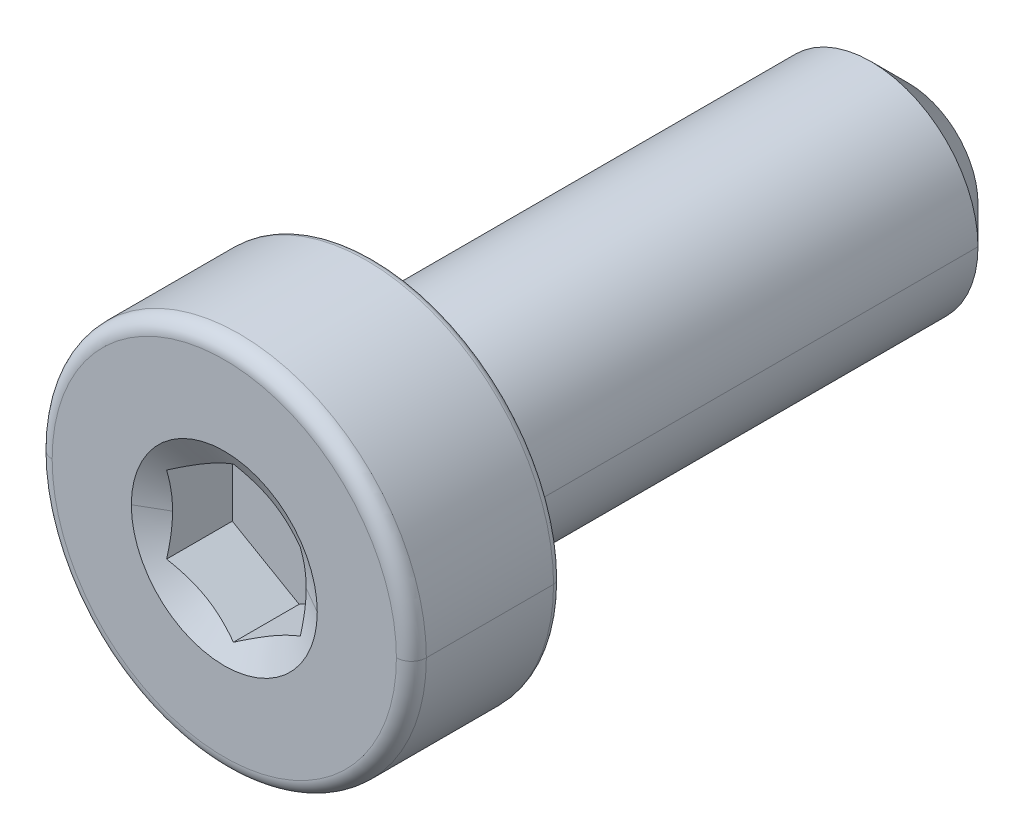
ISO-10303-21;
HEADER;
FILE_DESCRIPTION(('STEP AP214'),'2;1');
FILE_NAME('part.step','',(''),(''),'','','');
FILE_SCHEMA(('AUTOMOTIVE_DESIGN { 1 0 10303 214 1 1 1 1 }'));
ENDSEC;
DATA;
#1=APPLICATION_CONTEXT('core data for automotive mechanical design processes');
#2=APPLICATION_PROTOCOL_DEFINITION('international standard','automotive_design',2000,#1);
#3=PRODUCT_CONTEXT('',#1,'mechanical');
#4=PRODUCT('Part','Part','',(#3));
#5=PRODUCT_RELATED_PRODUCT_CATEGORY('part','',(#4));
#6=PRODUCT_DEFINITION_FORMATION('','',#4);
#7=PRODUCT_DEFINITION_CONTEXT('part definition',#1,'design');
#8=PRODUCT_DEFINITION('design','',#6,#7);
#9=PRODUCT_DEFINITION_SHAPE('','',#8);
#10=(LENGTH_UNIT() NAMED_UNIT(*) SI_UNIT(.MILLI.,.METRE.));
#11=(NAMED_UNIT(*) PLANE_ANGLE_UNIT() SI_UNIT($,.RADIAN.));
#12=(NAMED_UNIT(*) SI_UNIT($,.STERADIAN.) SOLID_ANGLE_UNIT());
#13=UNCERTAINTY_MEASURE_WITH_UNIT(LENGTH_MEASURE(1.E-05),#10,'distance_accuracy_value','');
#14=(GEOMETRIC_REPRESENTATION_CONTEXT(3) GLOBAL_UNCERTAINTY_ASSIGNED_CONTEXT((#13)) GLOBAL_UNIT_ASSIGNED_CONTEXT((#10,
#11,#12)) REPRESENTATION_CONTEXT('',''));
#15=CARTESIAN_POINT('',(0.,0.,0.));
#16=DIRECTION('',(0.,0.,1.));
#17=DIRECTION('',(1.,0.,0.));
#18=AXIS2_PLACEMENT_3D('',#15,#16,#17);
#19=CARTESIAN_POINT('',(0.,1.44337567297406,5.));
#20=DIRECTION('',(-0.5,0.866025403784439,0.));
#21=DIRECTION('',(0.,0.,1.));
#22=AXIS2_PLACEMENT_3D('',#19,#20,#21);
#23=PLANE('',#22);
#24=DIRECTION('',(0.,0.,1.));
#25=VECTOR('',#24,1.);
#26=CARTESIAN_POINT('',(0.,1.44337567297406,5.));
#27=LINE('',#26,#25);
#28=CARTESIAN_POINT('',(0.,1.44337567297406,5.));
#29=VERTEX_POINT('',#28);
#30=CARTESIAN_POINT('',(0.,1.44337567297406,6.22904424442379));
#31=VERTEX_POINT('',#30);
#32=EDGE_CURVE('E10',#29,#31,#27,.T.);
#33=ORIENTED_EDGE('',*,*,#32,.T.);
#34=CARTESIAN_POINT('',(0.,1.44337567297406,6.22904424442379));
#35=CARTESIAN_POINT('',(-0.334032893502101,1.25052169199244,6.11769994658497));
#36=CARTESIAN_POINT('',(-0.623808446138344,1.08321969867333,6.11739918476256));
#37=CARTESIAN_POINT('',(-0.914160739735603,0.915584723805126,6.1170978243332));
#38=CARTESIAN_POINT('',(-1.25,0.721687836487032,6.22904424442379));
#39=B_SPLINE_CURVE_WITH_KNOTS('',2,(#34,#35,#36,#37,#38),.UNSPECIFIED.,.F.,.F.,(3,2,3),(0.,0.5,
1.),.UNSPECIFIED.);
#40=CARTESIAN_POINT('',(-1.25,0.721687836487032,6.22904424442379));
#41=VERTEX_POINT('',#40);
#42=EDGE_CURVE('E180',#31,#41,#39,.T.);
#43=ORIENTED_EDGE('',*,*,#42,.T.);
#44=DIRECTION('',(0.,0.,1.));
#45=VECTOR('',#44,1.);
#46=CARTESIAN_POINT('',(-1.25,0.721687836487032,5.));
#47=LINE('',#46,#45);
#48=CARTESIAN_POINT('',(-1.25,0.721687836487032,5.));
#49=VERTEX_POINT('',#48);
#50=EDGE_CURVE('E174',#49,#41,#47,.T.);
#51=ORIENTED_EDGE('',*,*,#50,.F.);
#52=DIRECTION('',(-0.866025403784439,-0.5,0.));
#53=VECTOR('',#52,1.);
#54=CARTESIAN_POINT('',(0.,1.44337567297406,5.));
#55=LINE('',#54,#53);
#56=EDGE_CURVE('E409',#29,#49,#55,.T.);
#57=ORIENTED_EDGE('',*,*,#56,.F.);
#58=EDGE_LOOP('',(#33,#43,#51,#57));
#59=FACE_BOUND('',#58,.T.);
#60=ADVANCED_FACE('F16',(#59),#23,.F.);
#61=CARTESIAN_POINT('',(1.25,0.72168783648703,5.));
#62=DIRECTION('',(0.5,0.866025403784439,0.));
#63=DIRECTION('',(0.,0.,-1.));
#64=AXIS2_PLACEMENT_3D('',#61,#62,#63);
#65=PLANE('',#64);
#66=DIRECTION('',(0.,0.,1.));
#67=VECTOR('',#66,1.);
#68=CARTESIAN_POINT('',(1.25,0.72168783648703,5.));
#69=LINE('',#68,#67);
#70=CARTESIAN_POINT('',(1.25,0.72168783648703,5.));
#71=VERTEX_POINT('',#70);
#72=CARTESIAN_POINT('',(1.25,0.72168783648703,6.22904424442379));
#73=VERTEX_POINT('',#72);
#74=EDGE_CURVE('E28',#71,#73,#69,.T.);
#75=ORIENTED_EDGE('',*,*,#74,.T.);
#76=CARTESIAN_POINT('',(1.25,0.72168783648703,6.22904424442379));
#77=CARTESIAN_POINT('',(0.91596710649632,0.914541817469569,6.11769994658444));
#78=CARTESIAN_POINT('',(0.626191553861657,1.08184381078776,6.11739918476256));
#79=CARTESIAN_POINT('',(0.33583926026281,1.24947878565688,6.11709782433372));
#80=CARTESIAN_POINT('',(0.,1.44337567297406,6.22904424442379));
#81=B_SPLINE_CURVE_WITH_KNOTS('',2,(#76,#77,#78,#79,#80),.UNSPECIFIED.,.F.,.F.,(3,2,3),(0.,0.5,
1.),.UNSPECIFIED.);
#82=EDGE_CURVE('E338',#73,#31,#81,.T.);
#83=ORIENTED_EDGE('',*,*,#82,.T.);
#84=ORIENTED_EDGE('',*,*,#32,.F.);
#85=DIRECTION('',(-0.866025403784439,0.5,0.));
#86=VECTOR('',#85,1.);
#87=CARTESIAN_POINT('',(1.25,0.72168783648703,5.));
#88=LINE('',#87,#86);
#89=EDGE_CURVE('E378',#71,#29,#88,.T.);
#90=ORIENTED_EDGE('',*,*,#89,.F.);
#91=EDGE_LOOP('',(#75,#83,#84,#90));
#92=FACE_BOUND('',#91,.T.);
#93=ADVANCED_FACE('F300',(#92),#65,.F.);
#94=CARTESIAN_POINT('',(1.25,-0.721687836487031,5.));
#95=DIRECTION('',(1.,0.,0.));
#96=DIRECTION('',(0.,1.,0.));
#97=AXIS2_PLACEMENT_3D('',#94,#95,#96);
#98=PLANE('',#97);
#99=DIRECTION('',(0.,0.,1.));
#100=VECTOR('',#99,1.);
#101=CARTESIAN_POINT('',(1.25,-0.721687836487031,5.));
#102=LINE('',#101,#100);
#103=CARTESIAN_POINT('',(1.25,-0.721687836487031,5.));
#104=VERTEX_POINT('',#103);
#105=CARTESIAN_POINT('',(1.25,-0.721687836487031,6.22904424442379));
#106=VERTEX_POINT('',#105);
#107=EDGE_CURVE('E52',#104,#106,#102,.T.);
#108=ORIENTED_EDGE('',*,*,#107,.T.);
#109=CARTESIAN_POINT('',(1.25,-0.721687836487031,6.22904424442379));
#110=CARTESIAN_POINT('',(1.25,-0.334936490529257,6.1173987475747));
#111=CARTESIAN_POINT('',(1.25,2.57064335096313E-13,6.1173987475747));
#112=B_SPLINE_CURVE_WITH_KNOTS('',2,(#109,#110,#111),.UNSPECIFIED.,.F.,.F.,(3,3),(0.,1.),.UNSPECIFIED.);
#113=CARTESIAN_POINT('',(1.25,2.56757606599011E-13,6.1173987475747));
#114=VERTEX_POINT('',#113);
#115=EDGE_CURVE('E285',#106,#114,#112,.T.);
#116=ORIENTED_EDGE('',*,*,#115,.T.);
#117=CARTESIAN_POINT('',(1.25,2.57064335096313E-13,6.1173987475747));
#118=CARTESIAN_POINT('',(1.25,0.178322210871916,6.1173987475747));
#119=CARTESIAN_POINT('',(1.25,0.366220993478989,6.14773436286669));
#120=CARTESIAN_POINT('',(1.25,0.533672056437617,6.17476876381208));
#121=CARTESIAN_POINT('',(1.25,0.721687836487029,6.22904424442379));
#122=B_SPLINE_CURVE_WITH_KNOTS('',2,(#117,#118,#119,#120,#121),.UNSPECIFIED.,.F.,.F.,(3,2,3),
(0.,0.5,1.),.UNSPECIFIED.);
#123=EDGE_CURVE('E317',#114,#73,#122,.T.);
#124=ORIENTED_EDGE('',*,*,#123,.T.);
#125=ORIENTED_EDGE('',*,*,#74,.F.);
#126=DIRECTION('',(0.,1.,0.));
#127=VECTOR('',#126,1.);
#128=CARTESIAN_POINT('',(1.25,-0.721687836487031,5.));
#129=LINE('',#128,#127);
#130=EDGE_CURVE('E387',#104,#71,#129,.T.);
#131=ORIENTED_EDGE('',*,*,#130,.F.);
#132=EDGE_LOOP('',(#108,#116,#124,#125,#131));
#133=FACE_BOUND('',#132,.T.);
#134=ADVANCED_FACE('F291',(#133),#98,.F.);
#135=CARTESIAN_POINT('',(0.,-1.44337567297406,5.));
#136=DIRECTION('',(0.5,-0.866025403784438,0.));
#137=DIRECTION('',(0.,0.,-1.));
#138=AXIS2_PLACEMENT_3D('',#135,#136,#137);
#139=PLANE('',#138);
#140=DIRECTION('',(0.,0.,1.));
#141=VECTOR('',#140,1.);
#142=CARTESIAN_POINT('',(0.,-1.44337567297406,5.));
#143=LINE('',#142,#141);
#144=CARTESIAN_POINT('',(0.,-1.44337567297406,5.));
#145=VERTEX_POINT('',#144);
#146=CARTESIAN_POINT('',(0.,-1.44337567297406,6.22904424442379));
#147=VERTEX_POINT('',#146);
#148=EDGE_CURVE('E385',#145,#147,#143,.T.);
#149=ORIENTED_EDGE('',*,*,#148,.T.);
#150=CARTESIAN_POINT('',(0.,-1.44337567297406,6.22904424442379));
#151=CARTESIAN_POINT('',(0.334032893503682,-1.25052169199152,6.11769994658444));
#152=CARTESIAN_POINT('',(0.623808446138341,-1.08321969867333,6.11739918476256));
#153=CARTESIAN_POINT('',(0.914160739737189,-0.915584723804207,6.11709782433372));
#154=CARTESIAN_POINT('',(1.25,-0.721687836487031,6.22904424442379));
#155=B_SPLINE_CURVE_WITH_KNOTS('',2,(#150,#151,#152,#153,#154),.UNSPECIFIED.,.F.,.F.,(3,2,3),
(0.,0.5,1.),.UNSPECIFIED.);
#156=EDGE_CURVE('E544',#147,#106,#155,.T.);
#157=ORIENTED_EDGE('',*,*,#156,.T.);
#158=ORIENTED_EDGE('',*,*,#107,.F.);
#159=DIRECTION('',(0.866025403784438,0.5,0.));
#160=VECTOR('',#159,1.);
#161=CARTESIAN_POINT('',(0.,-1.44337567297406,5.));
#162=LINE('',#161,#160);
#163=EDGE_CURVE('E395',#145,#104,#162,.T.);
#164=ORIENTED_EDGE('',*,*,#163,.F.);
#165=EDGE_LOOP('',(#149,#157,#158,#164));
#166=FACE_BOUND('',#165,.T.);
#167=ADVANCED_FACE('F299',(#166),#139,.F.);
#168=CARTESIAN_POINT('',(-1.25,-0.721687836487033,5.));
#169=DIRECTION('',(-0.5,-0.866025403784439,0.));
#170=DIRECTION('',(-0.866025403784439,0.5,0.));
#171=AXIS2_PLACEMENT_3D('',#168,#169,#170);
#172=PLANE('',#171);
#173=DIRECTION('',(0.,0.,1.));
#174=VECTOR('',#173,1.);
#175=CARTESIAN_POINT('',(-1.25,-0.721687836487033,5.));
#176=LINE('',#175,#174);
#177=CARTESIAN_POINT('',(-1.25,-0.721687836487033,5.));
#178=VERTEX_POINT('',#177);
#179=CARTESIAN_POINT('',(-1.25,-0.721687836487033,6.22904424442379));
#180=VERTEX_POINT('',#179);
#181=EDGE_CURVE('E253',#178,#180,#176,.T.);
#182=ORIENTED_EDGE('',*,*,#181,.T.);
#183=CARTESIAN_POINT('',(-1.25,-0.721687836487033,6.22904424442379));
#184=CARTESIAN_POINT('',(-0.915967106497107,-0.914541817469118,6.11769994658471));
#185=CARTESIAN_POINT('',(-0.626191553861659,-1.08184381078777,6.11739918476256));
#186=CARTESIAN_POINT('',(-0.335839260263601,-1.24947878565643,6.11709782433346));
#187=CARTESIAN_POINT('',(0.,-1.44337567297406,6.22904424442379));
#188=B_SPLINE_CURVE_WITH_KNOTS('',2,(#183,#184,#185,#186,#187),.UNSPECIFIED.,.F.,.F.,(3,2,3),
(0.,0.5,1.),.UNSPECIFIED.);
#189=EDGE_CURVE('E198',#180,#147,#188,.T.);
#190=ORIENTED_EDGE('',*,*,#189,.T.);
#191=ORIENTED_EDGE('',*,*,#148,.F.);
#192=DIRECTION('',(0.866025403784439,-0.5,0.));
#193=VECTOR('',#192,1.);
#194=CARTESIAN_POINT('',(-1.25,-0.721687836487033,5.));
#195=LINE('',#194,#193);
#196=EDGE_CURVE('E401',#178,#145,#195,.T.);
#197=ORIENTED_EDGE('',*,*,#196,.F.);
#198=EDGE_LOOP('',(#182,#190,#191,#197));
#199=FACE_BOUND('',#198,.T.);
#200=ADVANCED_FACE('F216',(#199),#172,.F.);
#201=CARTESIAN_POINT('',(-1.25,0.721687836487032,5.));
#202=DIRECTION('',(-1.,0.,0.));
#203=DIRECTION('',(0.,1.,0.));
#204=AXIS2_PLACEMENT_3D('',#201,#202,#203);
#205=PLANE('',#204);
#206=ORIENTED_EDGE('',*,*,#50,.T.);
#207=CARTESIAN_POINT('',(-1.25,0.721687836487032,6.22904424442379));
#208=CARTESIAN_POINT('',(-1.25,0.53596383068638,6.1754303420518));
#209=CARTESIAN_POINT('',(-1.25,0.366220993478989,6.14773436286669));
#210=CARTESIAN_POINT('',(-1.25,0.180300381187919,6.1173987475747));
#211=CARTESIAN_POINT('',(-1.25,2.56955914879065E-13,6.1173987475747));
#212=B_SPLINE_CURVE_WITH_KNOTS('',2,(#207,#208,#209,#210,#211),.UNSPECIFIED.,.F.,.F.,(3,2,3),
(0.,0.5,1.),.UNSPECIFIED.);
#213=CARTESIAN_POINT('',(-1.25,2.56910687124712E-13,6.1173987475747));
#214=VERTEX_POINT('',#213);
#215=EDGE_CURVE('E166',#41,#214,#212,.T.);
#216=ORIENTED_EDGE('',*,*,#215,.T.);
#217=CARTESIAN_POINT('',(-1.25,2.56955914879065E-13,6.1173987475747));
#218=CARTESIAN_POINT('',(-1.25,-0.334936490529252,6.1173987475747));
#219=CARTESIAN_POINT('',(-1.25,-0.721687836487032,6.22904424442379));
#220=B_SPLINE_CURVE_WITH_KNOTS('',2,(#217,#218,#219),.UNSPECIFIED.,.F.,.F.,(3,3),(0.,1.),.UNSPECIFIED.);
#221=EDGE_CURVE('E171',#214,#180,#220,.T.);
#222=ORIENTED_EDGE('',*,*,#221,.T.);
#223=ORIENTED_EDGE('',*,*,#181,.F.);
#224=DIRECTION('',(0.,-1.,0.));
#225=VECTOR('',#224,1.);
#226=CARTESIAN_POINT('',(-1.25,0.721687836487032,5.));
#227=LINE('',#226,#225);
#228=EDGE_CURVE('E405',#49,#178,#227,.T.);
#229=ORIENTED_EDGE('',*,*,#228,.F.);
#230=EDGE_LOOP('',(#206,#216,#222,#223,#229));
#231=FACE_BOUND('',#230,.T.);
#232=ADVANCED_FACE('F169',(#231),#205,.F.);
#233=CARTESIAN_POINT('',(0.,0.,5.));
#234=DIRECTION('',(0.,0.,1.));
#235=DIRECTION('',(1.,0.,0.));
#236=AXIS2_PLACEMENT_3D('',#233,#234,#235);
#237=PLANE('',#236);
#238=ORIENTED_EDGE('',*,*,#56,.T.);
#239=ORIENTED_EDGE('',*,*,#228,.T.);
#240=ORIENTED_EDGE('',*,*,#196,.T.);
#241=ORIENTED_EDGE('',*,*,#163,.T.);
#242=ORIENTED_EDGE('',*,*,#130,.T.);
#243=ORIENTED_EDGE('',*,*,#89,.T.);
#244=EDGE_LOOP('',(#238,#239,#240,#241,#242,#243));
#245=FACE_BOUND('',#244,.T.);
#246=ADVANCED_FACE('F215',(#245),#237,.T.);
#247=CARTESIAN_POINT('',(0.,0.,6.4));
#248=DIRECTION('',(0.,0.,1.));
#249=DIRECTION('',(1.,0.,0.));
#250=AXIS2_PLACEMENT_3D('',#247,#248,#249);
#251=CONICAL_SURFACE('',#250,1.73947972747839,1.0471975511966);
#252=DIRECTION('',(-0.86602540378444,0.,0.5));
#253=VECTOR('',#252,1.);
#254=CARTESIAN_POINT('',(-1.73947972747839,0.,6.4));
#255=LINE('',#254,#253);
#256=CARTESIAN_POINT('',(-1.73947972747839,0.,6.4));
#257=VERTEX_POINT('',#256);
#258=EDGE_CURVE('E185',#214,#257,#255,.T.);
#259=ORIENTED_EDGE('',*,*,#258,.F.);
#260=ORIENTED_EDGE('',*,*,#215,.F.);
#261=ORIENTED_EDGE('',*,*,#42,.F.);
#262=ORIENTED_EDGE('',*,*,#82,.F.);
#263=ORIENTED_EDGE('',*,*,#123,.F.);
#264=DIRECTION('',(0.86602540378444,0.,0.5));
#265=VECTOR('',#264,1.);
#266=CARTESIAN_POINT('',(1.73947972747839,0.,6.4));
#267=LINE('',#266,#265);
#268=CARTESIAN_POINT('',(1.73947972747839,0.,6.4));
#269=VERTEX_POINT('',#268);
#270=EDGE_CURVE('E321',#114,#269,#267,.T.);
#271=ORIENTED_EDGE('',*,*,#270,.T.);
#272=CARTESIAN_POINT('',(0.,0.,6.4));
#273=DIRECTION('',(0.,0.,1.));
#274=DIRECTION('',(1.,0.,0.));
#275=AXIS2_PLACEMENT_3D('',#272,#273,#274);
#276=CIRCLE('',#275,1.73947972747839);
#277=EDGE_CURVE('E181',#269,#257,#276,.T.);
#278=ORIENTED_EDGE('',*,*,#277,.T.);
#279=EDGE_LOOP('',(#259,#260,#261,#262,#263,#271,#278));
#280=FACE_BOUND('',#279,.T.);
#281=ADVANCED_FACE('F186',(#280),#251,.F.);
#282=CARTESIAN_POINT('',(0.,3.22,6.4));
#283=DIRECTION('',(0.,0.,1.));
#284=DIRECTION('',(1.,0.,0.));
#285=AXIS2_PLACEMENT_3D('',#282,#283,#284);
#286=PLANE('',#285);
#287=ORIENTED_EDGE('',*,*,#277,.F.);
#288=CARTESIAN_POINT('',(0.,0.,6.4));
#289=DIRECTION('',(0.,0.,1.));
#290=DIRECTION('',(1.,0.,0.));
#291=AXIS2_PLACEMENT_3D('',#288,#289,#290);
#292=CIRCLE('',#291,1.73947972747839);
#293=EDGE_CURVE('E192',#257,#269,#292,.T.);
#294=ORIENTED_EDGE('',*,*,#293,.F.);
#295=EDGE_LOOP('',(#287,#294));
#296=FACE_BOUND('',#295,.T.);
#297=CARTESIAN_POINT('',(0.,0.,6.4));
#298=DIRECTION('',(0.,0.,-1.));
#299=DIRECTION('',(-1.,0.,0.));
#300=AXIS2_PLACEMENT_3D('',#297,#298,#299);
#301=CIRCLE('',#300,3.22);
#302=CARTESIAN_POINT('',(-3.22,0.,6.4));
#303=VERTEX_POINT('',#302);
#304=CARTESIAN_POINT('',(3.22,0.,6.4));
#305=VERTEX_POINT('',#304);
#306=EDGE_CURVE('E483',#303,#305,#301,.T.);
#307=ORIENTED_EDGE('',*,*,#306,.F.);
#308=CARTESIAN_POINT('',(0.,0.,6.4));
#309=DIRECTION('',(0.,0.,-1.));
#310=DIRECTION('',(-1.,0.,0.));
#311=AXIS2_PLACEMENT_3D('',#308,#309,#310);
#312=CIRCLE('',#311,3.22);
#313=EDGE_CURVE('E414',#305,#303,#312,.T.);
#314=ORIENTED_EDGE('',*,*,#313,.F.);
#315=EDGE_LOOP('',(#307,#314));
#316=FACE_BOUND('',#315,.T.);
#317=ADVANCED_FACE('F530',(#296,#316),#286,.T.);
#318=CARTESIAN_POINT('',(0.,0.,6.12));
#319=DIRECTION('',(0.,0.,-1.));
#320=DIRECTION('',(-1.,0.,0.));
#321=AXIS2_PLACEMENT_3D('',#318,#319,#320);
#322=TOROIDAL_SURFACE('',#321,3.22,0.28);
#323=CARTESIAN_POINT('',(3.22,0.,6.12));
#324=DIRECTION('',(0.,1.,0.));
#325=DIRECTION('',(-1.,0.,0.));
#326=AXIS2_PLACEMENT_3D('',#323,#324,#325);
#327=CIRCLE('',#326,0.28);
#328=CARTESIAN_POINT('',(3.5,0.,6.12));
#329=VERTEX_POINT('',#328);
#330=EDGE_CURVE('E479',#305,#329,#327,.T.);
#331=ORIENTED_EDGE('',*,*,#330,.F.);
#332=ORIENTED_EDGE('',*,*,#313,.T.);
#333=CARTESIAN_POINT('',(-3.22,0.,6.12));
#334=DIRECTION('',(0.,-1.,0.));
#335=DIRECTION('',(0.,0.,-1.));
#336=AXIS2_PLACEMENT_3D('',#333,#334,#335);
#337=CIRCLE('',#336,0.28);
#338=CARTESIAN_POINT('',(-3.5,0.,6.12));
#339=VERTEX_POINT('',#338);
#340=EDGE_CURVE('E470',#303,#339,#337,.T.);
#341=ORIENTED_EDGE('',*,*,#340,.T.);
#342=CARTESIAN_POINT('',(0.,0.,6.12));
#343=DIRECTION('',(0.,0.,-1.));
#344=DIRECTION('',(-1.,0.,0.));
#345=AXIS2_PLACEMENT_3D('',#342,#343,#344);
#346=CIRCLE('',#345,3.5);
#347=EDGE_CURVE('E417',#329,#339,#346,.T.);
#348=ORIENTED_EDGE('',*,*,#347,.F.);
#349=EDGE_LOOP('',(#331,#332,#341,#348));
#350=FACE_BOUND('',#349,.T.);
#351=ADVANCED_FACE('F528',(#350),#322,.T.);
#352=CARTESIAN_POINT('',(0.,0.,-6.4));
#353=DIRECTION('',(0.,0.,-1.));
#354=DIRECTION('',(-1.,0.,0.));
#355=AXIS2_PLACEMENT_3D('',#352,#353,#354);
#356=CYLINDRICAL_SURFACE('',#355,3.5);
#357=DIRECTION('',(0.,0.,-1.));
#358=VECTOR('',#357,1.);
#359=CARTESIAN_POINT('',(3.5,0.,-6.4));
#360=LINE('',#359,#358);
#361=CARTESIAN_POINT('',(3.5,0.,3.74));
#362=VERTEX_POINT('',#361);
#363=EDGE_CURVE('E466',#329,#362,#360,.T.);
#364=ORIENTED_EDGE('',*,*,#363,.F.);
#365=ORIENTED_EDGE('',*,*,#347,.T.);
#366=DIRECTION('',(0.,0.,-1.));
#367=VECTOR('',#366,1.);
#368=CARTESIAN_POINT('',(-3.5,0.,-6.4));
#369=LINE('',#368,#367);
#370=CARTESIAN_POINT('',(-3.5,0.,3.74));
#371=VERTEX_POINT('',#370);
#372=EDGE_CURVE('E460',#339,#371,#369,.T.);
#373=ORIENTED_EDGE('',*,*,#372,.T.);
#374=CARTESIAN_POINT('',(0.,0.,3.74));
#375=DIRECTION('',(0.,0.,-1.));
#376=DIRECTION('',(-1.,0.,0.));
#377=AXIS2_PLACEMENT_3D('',#374,#375,#376);
#378=CIRCLE('',#377,3.5);
#379=EDGE_CURVE('E420',#362,#371,#378,.T.);
#380=ORIENTED_EDGE('',*,*,#379,.F.);
#381=EDGE_LOOP('',(#364,#365,#373,#380));
#382=FACE_BOUND('',#381,.T.);
#383=ADVANCED_FACE('F519',(#382),#356,.T.);
#384=CARTESIAN_POINT('',(0.,0.,3.74));
#385=DIRECTION('',(0.,0.,-1.));
#386=DIRECTION('',(-1.,0.,0.));
#387=AXIS2_PLACEMENT_3D('',#384,#385,#386);
#388=TOROIDAL_SURFACE('',#387,3.36,0.14);
#389=CARTESIAN_POINT('',(3.36,0.,3.74));
#390=DIRECTION('',(0.,1.,0.));
#391=DIRECTION('',(-1.,0.,0.));
#392=AXIS2_PLACEMENT_3D('',#389,#390,#391);
#393=CIRCLE('',#392,0.14);
#394=CARTESIAN_POINT('',(3.36,0.,3.6));
#395=VERTEX_POINT('',#394);
#396=EDGE_CURVE('E464',#362,#395,#393,.T.);
#397=ORIENTED_EDGE('',*,*,#396,.F.);
#398=ORIENTED_EDGE('',*,*,#379,.T.);
#399=CARTESIAN_POINT('',(-3.36,0.,3.74));
#400=DIRECTION('',(0.,-1.,0.));
#401=DIRECTION('',(0.,0.,-1.));
#402=AXIS2_PLACEMENT_3D('',#399,#400,#401);
#403=CIRCLE('',#402,0.14);
#404=CARTESIAN_POINT('',(-3.36,0.,3.6));
#405=VERTEX_POINT('',#404);
#406=EDGE_CURVE('E459',#371,#405,#403,.T.);
#407=ORIENTED_EDGE('',*,*,#406,.T.);
#408=CARTESIAN_POINT('',(0.,0.,3.6));
#409=DIRECTION('',(0.,0.,-1.));
#410=DIRECTION('',(-1.,0.,0.));
#411=AXIS2_PLACEMENT_3D('',#408,#409,#410);
#412=CIRCLE('',#411,3.36);
#413=EDGE_CURVE('E423',#395,#405,#412,.T.);
#414=ORIENTED_EDGE('',*,*,#413,.F.);
#415=EDGE_LOOP('',(#397,#398,#407,#414));
#416=FACE_BOUND('',#415,.T.);
#417=ADVANCED_FACE('F515',(#416),#388,.T.);
#418=CARTESIAN_POINT('',(0.,2.,3.6));
#419=DIRECTION('',(0.,0.,-1.));
#420=DIRECTION('',(0.,-1.,0.));
#421=AXIS2_PLACEMENT_3D('',#418,#419,#420);
#422=PLANE('',#421);
#423=CARTESIAN_POINT('',(0.,0.,3.6));
#424=DIRECTION('',(0.,0.,-1.));
#425=DIRECTION('',(-1.,0.,0.));
#426=AXIS2_PLACEMENT_3D('',#423,#424,#425);
#427=CIRCLE('',#426,2.);
#428=CARTESIAN_POINT('',(-2.,0.,3.6));
#429=VERTEX_POINT('',#428);
#430=CARTESIAN_POINT('',(2.,0.,3.6));
#431=VERTEX_POINT('',#430);
#432=EDGE_CURVE('E455',#429,#431,#427,.T.);
#433=ORIENTED_EDGE('',*,*,#432,.F.);
#434=CARTESIAN_POINT('',(0.,0.,3.6));
#435=DIRECTION('',(0.,0.,-1.));
#436=DIRECTION('',(-1.,0.,0.));
#437=AXIS2_PLACEMENT_3D('',#434,#435,#436);
#438=CIRCLE('',#437,2.);
#439=EDGE_CURVE('E424',#431,#429,#438,.T.);
#440=ORIENTED_EDGE('',*,*,#439,.F.);
#441=EDGE_LOOP('',(#433,#440));
#442=FACE_BOUND('',#441,.T.);
#443=CARTESIAN_POINT('',(0.,0.,3.6));
#444=DIRECTION('',(0.,0.,-1.));
#445=DIRECTION('',(-1.,0.,0.));
#446=AXIS2_PLACEMENT_3D('',#443,#444,#445);
#447=CIRCLE('',#446,3.36);
#448=EDGE_CURVE('E478',#405,#395,#447,.T.);
#449=ORIENTED_EDGE('',*,*,#448,.T.);
#450=ORIENTED_EDGE('',*,*,#413,.T.);
#451=EDGE_LOOP('',(#449,#450));
#452=FACE_BOUND('',#451,.T.);
#453=ADVANCED_FACE('F508',(#442,#452),#422,.T.);
#454=CARTESIAN_POINT('',(0.,0.,-6.4));
#455=DIRECTION('',(0.,0.,-1.));
#456=DIRECTION('',(-1.,0.,0.));
#457=AXIS2_PLACEMENT_3D('',#454,#455,#456);
#458=CYLINDRICAL_SURFACE('',#457,2.);
#459=DIRECTION('',(0.,0.,-1.));
#460=VECTOR('',#459,1.);
#461=CARTESIAN_POINT('',(2.,0.,-6.4));
#462=LINE('',#461,#460);
#463=CARTESIAN_POINT('',(2.,0.,-5.7));
#464=VERTEX_POINT('',#463);
#465=EDGE_CURVE('E451',#431,#464,#462,.T.);
#466=ORIENTED_EDGE('',*,*,#465,.F.);
#467=ORIENTED_EDGE('',*,*,#439,.T.);
#468=DIRECTION('',(0.,0.,-1.));
#469=VECTOR('',#468,1.);
#470=CARTESIAN_POINT('',(-2.,0.,-6.4));
#471=LINE('',#470,#469);
#472=CARTESIAN_POINT('',(-2.,0.,-5.7));
#473=VERTEX_POINT('',#472);
#474=EDGE_CURVE('E443',#429,#473,#471,.T.);
#475=ORIENTED_EDGE('',*,*,#474,.T.);
#476=CARTESIAN_POINT('',(0.,0.,-5.7));
#477=DIRECTION('',(0.,0.,-1.));
#478=DIRECTION('',(-1.,0.,0.));
#479=AXIS2_PLACEMENT_3D('',#476,#477,#478);
#480=CIRCLE('',#479,2.);
#481=EDGE_CURVE('E427',#464,#473,#480,.T.);
#482=ORIENTED_EDGE('',*,*,#481,.F.);
#483=EDGE_LOOP('',(#466,#467,#475,#482));
#484=FACE_BOUND('',#483,.T.);
#485=ADVANCED_FACE('F678',(#484),#458,.T.);
#486=CARTESIAN_POINT('',(0.,0.,-6.4));
#487=DIRECTION('',(0.,0.,1.));
#488=DIRECTION('',(1.,0.,0.));
#489=AXIS2_PLACEMENT_3D('',#486,#487,#488);
#490=CONICAL_SURFACE('',#489,1.3,0.785398163397449);
#491=DIRECTION('',(-0.707106781186548,0.,0.707106781186547));
#492=VECTOR('',#491,1.);
#493=CARTESIAN_POINT('',(-1.3,0.,-6.4));
#494=LINE('',#493,#492);
#495=CARTESIAN_POINT('',(-1.3,0.,-6.4));
#496=VERTEX_POINT('',#495);
#497=EDGE_CURVE('E435',#496,#473,#494,.T.);
#498=ORIENTED_EDGE('',*,*,#497,.F.);
#499=CARTESIAN_POINT('',(0.,0.,-6.4));
#500=DIRECTION('',(0.,0.,-1.));
#501=DIRECTION('',(-1.,0.,0.));
#502=AXIS2_PLACEMENT_3D('',#499,#500,#501);
#503=CIRCLE('',#502,1.3);
#504=CARTESIAN_POINT('',(1.3,0.,-6.4));
#505=VERTEX_POINT('',#504);
#506=EDGE_CURVE('E430',#505,#496,#503,.T.);
#507=ORIENTED_EDGE('',*,*,#506,.F.);
#508=DIRECTION('',(0.707106781186548,0.,0.707106781186547));
#509=VECTOR('',#508,1.);
#510=CARTESIAN_POINT('',(1.3,0.,-6.4));
#511=LINE('',#510,#509);
#512=EDGE_CURVE('E431',#505,#464,#511,.T.);
#513=ORIENTED_EDGE('',*,*,#512,.T.);
#514=ORIENTED_EDGE('',*,*,#481,.T.);
#515=EDGE_LOOP('',(#498,#507,#513,#514));
#516=FACE_BOUND('',#515,.T.);
#517=ADVANCED_FACE('F622',(#516),#490,.T.);
#518=CARTESIAN_POINT('',(0.,0.,-6.4));
#519=DIRECTION('',(0.,0.,-1.));
#520=DIRECTION('',(0.,-1.,0.));
#521=AXIS2_PLACEMENT_3D('',#518,#519,#520);
#522=PLANE('',#521);
#523=ORIENTED_EDGE('',*,*,#506,.T.);
#524=CARTESIAN_POINT('',(0.,0.,-6.4));
#525=DIRECTION('',(0.,0.,-1.));
#526=DIRECTION('',(-1.,0.,0.));
#527=AXIS2_PLACEMENT_3D('',#524,#525,#526);
#528=CIRCLE('',#527,1.3);
#529=EDGE_CURVE('E439',#496,#505,#528,.T.);
#530=ORIENTED_EDGE('',*,*,#529,.T.);
#531=EDGE_LOOP('',(#523,#530));
#532=FACE_BOUND('',#531,.T.);
#533=ADVANCED_FACE('F616',(#532),#522,.T.);
#534=CARTESIAN_POINT('',(0.,0.,-6.4));
#535=DIRECTION('',(0.,0.,1.));
#536=DIRECTION('',(1.,0.,0.));
#537=AXIS2_PLACEMENT_3D('',#534,#535,#536);
#538=CONICAL_SURFACE('',#537,1.3,0.785398163397449);
#539=ORIENTED_EDGE('',*,*,#529,.F.);
#540=ORIENTED_EDGE('',*,*,#497,.T.);
#541=CARTESIAN_POINT('',(0.,0.,-5.7));
#542=DIRECTION('',(0.,0.,-1.));
#543=DIRECTION('',(-1.,0.,0.));
#544=AXIS2_PLACEMENT_3D('',#541,#542,#543);
#545=CIRCLE('',#544,2.);
#546=EDGE_CURVE('E447',#473,#464,#545,.T.);
#547=ORIENTED_EDGE('',*,*,#546,.T.);
#548=ORIENTED_EDGE('',*,*,#512,.F.);
#549=EDGE_LOOP('',(#539,#540,#547,#548));
#550=FACE_BOUND('',#549,.T.);
#551=ADVANCED_FACE('F621',(#550),#538,.T.);
#552=CARTESIAN_POINT('',(0.,0.,-6.4));
#553=DIRECTION('',(0.,0.,-1.));
#554=DIRECTION('',(-1.,0.,0.));
#555=AXIS2_PLACEMENT_3D('',#552,#553,#554);
#556=CYLINDRICAL_SURFACE('',#555,2.);
#557=ORIENTED_EDGE('',*,*,#432,.T.);
#558=ORIENTED_EDGE('',*,*,#465,.T.);
#559=ORIENTED_EDGE('',*,*,#546,.F.);
#560=ORIENTED_EDGE('',*,*,#474,.F.);
#561=EDGE_LOOP('',(#557,#558,#559,#560));
#562=FACE_BOUND('',#561,.T.);
#563=ADVANCED_FACE('F635',(#562),#556,.T.);
#564=CARTESIAN_POINT('',(0.,0.,3.74));
#565=DIRECTION('',(0.,0.,-1.));
#566=DIRECTION('',(-1.,0.,0.));
#567=AXIS2_PLACEMENT_3D('',#564,#565,#566);
#568=TOROIDAL_SURFACE('',#567,3.36,0.14);
#569=CARTESIAN_POINT('',(0.,0.,3.74));
#570=DIRECTION('',(0.,0.,-1.));
#571=DIRECTION('',(-1.,0.,0.));
#572=AXIS2_PLACEMENT_3D('',#569,#570,#571);
#573=CIRCLE('',#572,3.5);
#574=EDGE_CURVE('E465',#371,#362,#573,.T.);
#575=ORIENTED_EDGE('',*,*,#574,.T.);
#576=ORIENTED_EDGE('',*,*,#396,.T.);
#577=ORIENTED_EDGE('',*,*,#448,.F.);
#578=ORIENTED_EDGE('',*,*,#406,.F.);
#579=EDGE_LOOP('',(#575,#576,#577,#578));
#580=FACE_BOUND('',#579,.T.);
#581=ADVANCED_FACE('F512',(#580),#568,.T.);
#582=CARTESIAN_POINT('',(0.,0.,-6.4));
#583=DIRECTION('',(0.,0.,-1.));
#584=DIRECTION('',(-1.,0.,0.));
#585=AXIS2_PLACEMENT_3D('',#582,#583,#584);
#586=CYLINDRICAL_SURFACE('',#585,3.5);
#587=CARTESIAN_POINT('',(0.,0.,6.12));
#588=DIRECTION('',(0.,0.,-1.));
#589=DIRECTION('',(-1.,0.,0.));
#590=AXIS2_PLACEMENT_3D('',#587,#588,#589);
#591=CIRCLE('',#590,3.5);
#592=EDGE_CURVE('E474',#339,#329,#591,.T.);
#593=ORIENTED_EDGE('',*,*,#592,.T.);
#594=ORIENTED_EDGE('',*,*,#363,.T.);
#595=ORIENTED_EDGE('',*,*,#574,.F.);
#596=ORIENTED_EDGE('',*,*,#372,.F.);
#597=EDGE_LOOP('',(#593,#594,#595,#596));
#598=FACE_BOUND('',#597,.T.);
#599=ADVANCED_FACE('F521',(#598),#586,.T.);
#600=CARTESIAN_POINT('',(0.,0.,6.12));
#601=DIRECTION('',(0.,0.,-1.));
#602=DIRECTION('',(-1.,0.,0.));
#603=AXIS2_PLACEMENT_3D('',#600,#601,#602);
#604=TOROIDAL_SURFACE('',#603,3.22,0.28);
#605=ORIENTED_EDGE('',*,*,#306,.T.);
#606=ORIENTED_EDGE('',*,*,#330,.T.);
#607=ORIENTED_EDGE('',*,*,#592,.F.);
#608=ORIENTED_EDGE('',*,*,#340,.F.);
#609=EDGE_LOOP('',(#605,#606,#607,#608));
#610=FACE_BOUND('',#609,.T.);
#611=ADVANCED_FACE('F263',(#610),#604,.T.);
#612=CARTESIAN_POINT('',(0.,0.,6.4));
#613=DIRECTION('',(0.,0.,1.));
#614=DIRECTION('',(1.,0.,0.));
#615=AXIS2_PLACEMENT_3D('',#612,#613,#614);
#616=CONICAL_SURFACE('',#615,1.73947972747839,1.0471975511966);
#617=ORIENTED_EDGE('',*,*,#221,.F.);
#618=ORIENTED_EDGE('',*,*,#258,.T.);
#619=ORIENTED_EDGE('',*,*,#293,.T.);
#620=ORIENTED_EDGE('',*,*,#270,.F.);
#621=ORIENTED_EDGE('',*,*,#115,.F.);
#622=ORIENTED_EDGE('',*,*,#156,.F.);
#623=ORIENTED_EDGE('',*,*,#189,.F.);
#624=EDGE_LOOP('',(#617,#618,#619,#620,#621,#622,#623));
#625=FACE_BOUND('',#624,.T.);
#626=ADVANCED_FACE('F195',(#625),#616,.F.);
#627=CLOSED_SHELL('',(#60,#93,#134,#167,#200,#232,#246,#281,#317,#351,#383,#417,#453,#485,#517,
#533,#551,#563,#581,#599,#611,#626));
#628=MANIFOLD_SOLID_BREP('B1',#627);
#629=ADVANCED_BREP_SHAPE_REPRESENTATION('',(#18,#628),#14);
#630=SHAPE_DEFINITION_REPRESENTATION(#9,#629);
ENDSEC;
END-ISO-10303-21;
